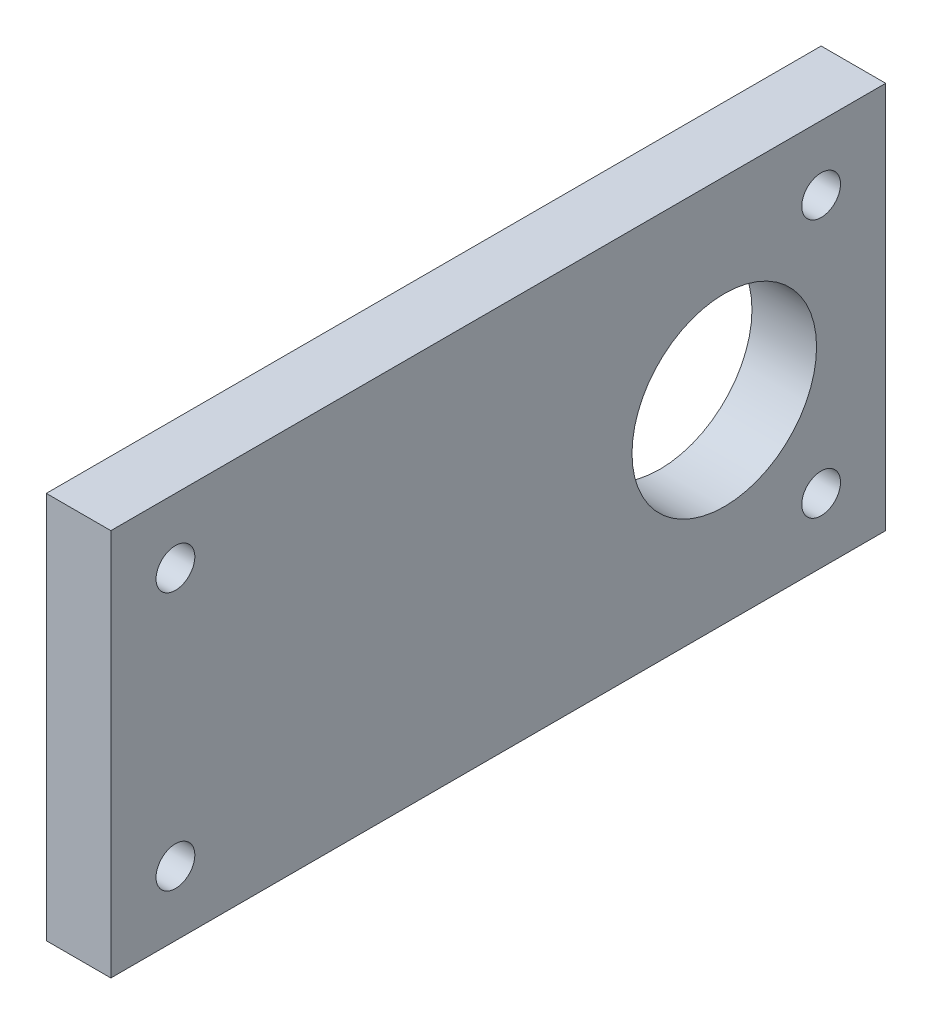
ISO-10303-21;
HEADER;
FILE_DESCRIPTION(('STEP AP214'),'2;1');
FILE_NAME('part.step','',(''),(''),'','','');
FILE_SCHEMA(('AUTOMOTIVE_DESIGN { 1 0 10303 214 1 1 1 1 }'));
ENDSEC;
DATA;
#1=APPLICATION_CONTEXT('core data for automotive mechanical design processes');
#2=APPLICATION_PROTOCOL_DEFINITION('international standard','automotive_design',2000,#1);
#3=PRODUCT_CONTEXT('',#1,'mechanical');
#4=PRODUCT('Part','Part','',(#3));
#5=PRODUCT_RELATED_PRODUCT_CATEGORY('part','',(#4));
#6=PRODUCT_DEFINITION_FORMATION('','',#4);
#7=PRODUCT_DEFINITION_CONTEXT('part definition',#1,'design');
#8=PRODUCT_DEFINITION('design','',#6,#7);
#9=PRODUCT_DEFINITION_SHAPE('','',#8);
#10=(LENGTH_UNIT() NAMED_UNIT(*) SI_UNIT(.MILLI.,.METRE.));
#11=(NAMED_UNIT(*) PLANE_ANGLE_UNIT() SI_UNIT($,.RADIAN.));
#12=(NAMED_UNIT(*) SI_UNIT($,.STERADIAN.) SOLID_ANGLE_UNIT());
#13=UNCERTAINTY_MEASURE_WITH_UNIT(LENGTH_MEASURE(1.E-05),#10,'distance_accuracy_value','');
#14=(GEOMETRIC_REPRESENTATION_CONTEXT(3) GLOBAL_UNCERTAINTY_ASSIGNED_CONTEXT((#13)) GLOBAL_UNIT_ASSIGNED_CONTEXT((#10,
#11,#12)) REPRESENTATION_CONTEXT('',''));
#15=CARTESIAN_POINT('',(0.,0.,0.));
#16=DIRECTION('',(0.,0.,1.));
#17=DIRECTION('',(1.,0.,0.));
#18=AXIS2_PLACEMENT_3D('',#15,#16,#17);
#19=CARTESIAN_POINT('',(10.,30.,80.));
#20=DIRECTION('',(0.,-1.,0.));
#21=DIRECTION('',(0.,0.,-1.));
#22=AXIS2_PLACEMENT_3D('',#19,#20,#21);
#23=PLANE('',#22);
#24=DIRECTION('',(0.,0.,1.));
#25=VECTOR('',#24,1.);
#26=CARTESIAN_POINT('',(10.,30.,80.));
#27=LINE('',#26,#25);
#28=CARTESIAN_POINT('',(10.,30.,-40.));
#29=VERTEX_POINT('',#28);
#30=CARTESIAN_POINT('',(10.,30.,80.));
#31=VERTEX_POINT('',#30);
#32=EDGE_CURVE('E95',#29,#31,#27,.T.);
#33=ORIENTED_EDGE('',*,*,#32,.F.);
#34=DIRECTION('',(-1.,0.,0.));
#35=VECTOR('',#34,1.);
#36=CARTESIAN_POINT('',(10.,30.,-40.));
#37=LINE('',#36,#35);
#38=CARTESIAN_POINT('',(0.,30.,-40.));
#39=VERTEX_POINT('',#38);
#40=EDGE_CURVE('E111',#29,#39,#37,.T.);
#41=ORIENTED_EDGE('',*,*,#40,.T.);
#42=DIRECTION('',(0.,0.,1.));
#43=VECTOR('',#42,1.);
#44=CARTESIAN_POINT('',(0.,30.,80.));
#45=LINE('',#44,#43);
#46=CARTESIAN_POINT('',(0.,30.,80.));
#47=VERTEX_POINT('',#46);
#48=EDGE_CURVE('E84',#39,#47,#45,.T.);
#49=ORIENTED_EDGE('',*,*,#48,.T.);
#50=DIRECTION('',(-1.,0.,0.));
#51=VECTOR('',#50,1.);
#52=CARTESIAN_POINT('',(10.,30.,80.));
#53=LINE('',#52,#51);
#54=EDGE_CURVE('E11',#31,#47,#53,.T.);
#55=ORIENTED_EDGE('',*,*,#54,.F.);
#56=EDGE_LOOP('',(#33,#41,#49,#55));
#57=FACE_BOUND('',#56,.T.);
#58=ADVANCED_FACE('F38',(#57),#23,.F.);
#59=CARTESIAN_POINT('',(10.,-30.,80.));
#60=DIRECTION('',(0.,0.,-1.));
#61=DIRECTION('',(-1.,0.,0.));
#62=AXIS2_PLACEMENT_3D('',#59,#60,#61);
#63=PLANE('',#62);
#64=DIRECTION('',(0.,-1.,0.));
#65=VECTOR('',#64,1.);
#66=CARTESIAN_POINT('',(0.,-30.,80.));
#67=LINE('',#66,#65);
#68=CARTESIAN_POINT('',(0.,-30.,80.));
#69=VERTEX_POINT('',#68);
#70=EDGE_CURVE('E74',#47,#69,#67,.T.);
#71=ORIENTED_EDGE('',*,*,#70,.T.);
#72=DIRECTION('',(-1.,0.,0.));
#73=VECTOR('',#72,1.);
#74=CARTESIAN_POINT('',(10.,-30.,80.));
#75=LINE('',#74,#73);
#76=CARTESIAN_POINT('',(10.,-30.,80.));
#77=VERTEX_POINT('',#76);
#78=EDGE_CURVE('E46',#77,#69,#75,.T.);
#79=ORIENTED_EDGE('',*,*,#78,.F.);
#80=DIRECTION('',(0.,-1.,0.));
#81=VECTOR('',#80,1.);
#82=CARTESIAN_POINT('',(10.,-30.,80.));
#83=LINE('',#82,#81);
#84=EDGE_CURVE('E62',#31,#77,#83,.T.);
#85=ORIENTED_EDGE('',*,*,#84,.F.);
#86=ORIENTED_EDGE('',*,*,#54,.T.);
#87=EDGE_LOOP('',(#71,#79,#85,#86));
#88=FACE_BOUND('',#87,.T.);
#89=ADVANCED_FACE('F76',(#88),#63,.F.);
#90=CARTESIAN_POINT('',(10.,-30.,80.));
#91=DIRECTION('',(0.,1.,0.));
#92=DIRECTION('',(0.,0.,1.));
#93=AXIS2_PLACEMENT_3D('',#90,#91,#92);
#94=PLANE('',#93);
#95=DIRECTION('',(0.,0.,-1.));
#96=VECTOR('',#95,1.);
#97=CARTESIAN_POINT('',(0.,-30.,80.));
#98=LINE('',#97,#96);
#99=CARTESIAN_POINT('',(0.,-30.,-40.));
#100=VERTEX_POINT('',#99);
#101=EDGE_CURVE('E83',#69,#100,#98,.T.);
#102=ORIENTED_EDGE('',*,*,#101,.T.);
#103=DIRECTION('',(-1.,0.,0.));
#104=VECTOR('',#103,1.);
#105=CARTESIAN_POINT('',(10.,-30.,-40.));
#106=LINE('',#105,#104);
#107=CARTESIAN_POINT('',(10.,-30.,-40.));
#108=VERTEX_POINT('',#107);
#109=EDGE_CURVE('E53',#108,#100,#106,.T.);
#110=ORIENTED_EDGE('',*,*,#109,.F.);
#111=DIRECTION('',(0.,0.,-1.));
#112=VECTOR('',#111,1.);
#113=CARTESIAN_POINT('',(10.,-30.,80.));
#114=LINE('',#113,#112);
#115=EDGE_CURVE('E89',#77,#108,#114,.T.);
#116=ORIENTED_EDGE('',*,*,#115,.F.);
#117=ORIENTED_EDGE('',*,*,#78,.T.);
#118=EDGE_LOOP('',(#102,#110,#116,#117));
#119=FACE_BOUND('',#118,.T.);
#120=ADVANCED_FACE('F88',(#119),#94,.F.);
#121=CARTESIAN_POINT('',(10.,0.,0.));
#122=DIRECTION('',(-1.,0.,0.));
#123=DIRECTION('',(0.,0.,1.));
#124=AXIS2_PLACEMENT_3D('',#121,#122,#123);
#125=PLANE('',#124);
#126=CARTESIAN_POINT('',(10.,-20.,70.));
#127=DIRECTION('',(-1.,0.,0.));
#128=DIRECTION('',(0.,0.,1.));
#129=AXIS2_PLACEMENT_3D('',#126,#127,#128);
#130=CIRCLE('',#129,3.00000000000001);
#131=CARTESIAN_POINT('',(10.,-20.,73.));
#132=VERTEX_POINT('',#131);
#133=EDGE_CURVE('E139',#132,#132,#130,.T.);
#134=ORIENTED_EDGE('',*,*,#133,.T.);
#135=EDGE_LOOP('',(#134));
#136=FACE_BOUND('',#135,.T.);
#137=CARTESIAN_POINT('',(10.,-20.,-30.));
#138=DIRECTION('',(-1.,0.,0.));
#139=DIRECTION('',(0.,0.,1.));
#140=AXIS2_PLACEMENT_3D('',#137,#138,#139);
#141=CIRCLE('',#140,3.);
#142=CARTESIAN_POINT('',(10.,-20.,-27.));
#143=VERTEX_POINT('',#142);
#144=EDGE_CURVE('E147',#143,#143,#141,.T.);
#145=ORIENTED_EDGE('',*,*,#144,.T.);
#146=EDGE_LOOP('',(#145));
#147=FACE_BOUND('',#146,.T.);
#148=CARTESIAN_POINT('',(10.,20.,-30.));
#149=DIRECTION('',(-1.,0.,0.));
#150=DIRECTION('',(0.,0.,1.));
#151=AXIS2_PLACEMENT_3D('',#148,#149,#150);
#152=CIRCLE('',#151,3.);
#153=CARTESIAN_POINT('',(10.,20.,-27.));
#154=VERTEX_POINT('',#153);
#155=EDGE_CURVE('E131',#154,#154,#152,.T.);
#156=ORIENTED_EDGE('',*,*,#155,.T.);
#157=EDGE_LOOP('',(#156));
#158=FACE_BOUND('',#157,.T.);
#159=CARTESIAN_POINT('',(10.,20.,70.));
#160=DIRECTION('',(-1.,0.,0.));
#161=DIRECTION('',(0.,0.,1.));
#162=AXIS2_PLACEMENT_3D('',#159,#160,#161);
#163=CIRCLE('',#162,3.00000000000001);
#164=CARTESIAN_POINT('',(10.,20.,73.));
#165=VERTEX_POINT('',#164);
#166=EDGE_CURVE('E123',#165,#165,#163,.T.);
#167=ORIENTED_EDGE('',*,*,#166,.T.);
#168=EDGE_LOOP('',(#167));
#169=FACE_BOUND('',#168,.T.);
#170=CARTESIAN_POINT('',(10.,-4.8919202022546E-13,-14.9999999999983));
#171=DIRECTION('',(-1.,0.,0.));
#172=DIRECTION('',(0.,0.,1.));
#173=AXIS2_PLACEMENT_3D('',#170,#171,#172);
#174=CIRCLE('',#173,14.289999999987);
#175=CARTESIAN_POINT('',(10.,-4.8919202022546E-13,-0.710000000011321));
#176=VERTEX_POINT('',#175);
#177=EDGE_CURVE('E102',#176,#176,#174,.T.);
#178=ORIENTED_EDGE('',*,*,#177,.T.);
#179=EDGE_LOOP('',(#178));
#180=FACE_BOUND('',#179,.T.);
#181=ORIENTED_EDGE('',*,*,#115,.T.);
#182=DIRECTION('',(0.,1.,0.));
#183=VECTOR('',#182,1.);
#184=CARTESIAN_POINT('',(10.,30.,-40.));
#185=LINE('',#184,#183);
#186=EDGE_CURVE('E117',#108,#29,#185,.T.);
#187=ORIENTED_EDGE('',*,*,#186,.T.);
#188=ORIENTED_EDGE('',*,*,#32,.T.);
#189=ORIENTED_EDGE('',*,*,#84,.T.);
#190=EDGE_LOOP('',(#181,#187,#188,#189));
#191=FACE_BOUND('',#190,.T.);
#192=ADVANCED_FACE('F159',(#136,#147,#158,#169,#180,#191),#125,.F.);
#193=CARTESIAN_POINT('',(0.,0.,0.));
#194=DIRECTION('',(-1.,0.,0.));
#195=DIRECTION('',(0.,0.,1.));
#196=AXIS2_PLACEMENT_3D('',#193,#194,#195);
#197=PLANE('',#196);
#198=CARTESIAN_POINT('',(0.,-20.,70.));
#199=DIRECTION('',(-1.,0.,0.));
#200=DIRECTION('',(0.,0.,1.));
#201=AXIS2_PLACEMENT_3D('',#198,#199,#200);
#202=CIRCLE('',#201,3.00000000000001);
#203=CARTESIAN_POINT('',(0.,-20.,73.));
#204=VERTEX_POINT('',#203);
#205=EDGE_CURVE('E135',#204,#204,#202,.T.);
#206=ORIENTED_EDGE('',*,*,#205,.F.);
#207=EDGE_LOOP('',(#206));
#208=FACE_BOUND('',#207,.T.);
#209=CARTESIAN_POINT('',(0.,-20.,-30.));
#210=DIRECTION('',(-1.,0.,0.));
#211=DIRECTION('',(0.,0.,1.));
#212=AXIS2_PLACEMENT_3D('',#209,#210,#211);
#213=CIRCLE('',#212,3.);
#214=CARTESIAN_POINT('',(0.,-20.,-27.));
#215=VERTEX_POINT('',#214);
#216=EDGE_CURVE('E143',#215,#215,#213,.T.);
#217=ORIENTED_EDGE('',*,*,#216,.F.);
#218=EDGE_LOOP('',(#217));
#219=FACE_BOUND('',#218,.T.);
#220=CARTESIAN_POINT('',(0.,20.,-30.));
#221=DIRECTION('',(-1.,0.,0.));
#222=DIRECTION('',(0.,0.,1.));
#223=AXIS2_PLACEMENT_3D('',#220,#221,#222);
#224=CIRCLE('',#223,3.);
#225=CARTESIAN_POINT('',(0.,20.,-27.));
#226=VERTEX_POINT('',#225);
#227=EDGE_CURVE('E151',#226,#226,#224,.T.);
#228=ORIENTED_EDGE('',*,*,#227,.F.);
#229=EDGE_LOOP('',(#228));
#230=FACE_BOUND('',#229,.T.);
#231=CARTESIAN_POINT('',(0.,20.,70.));
#232=DIRECTION('',(-1.,0.,0.));
#233=DIRECTION('',(0.,0.,1.));
#234=AXIS2_PLACEMENT_3D('',#231,#232,#233);
#235=CIRCLE('',#234,3.00000000000001);
#236=CARTESIAN_POINT('',(0.,20.,73.));
#237=VERTEX_POINT('',#236);
#238=EDGE_CURVE('E127',#237,#237,#235,.T.);
#239=ORIENTED_EDGE('',*,*,#238,.F.);
#240=EDGE_LOOP('',(#239));
#241=FACE_BOUND('',#240,.T.);
#242=DIRECTION('',(0.,1.,0.));
#243=VECTOR('',#242,1.);
#244=CARTESIAN_POINT('',(0.,30.,-40.));
#245=LINE('',#244,#243);
#246=EDGE_CURVE('E93',#100,#39,#245,.T.);
#247=ORIENTED_EDGE('',*,*,#246,.F.);
#248=ORIENTED_EDGE('',*,*,#101,.F.);
#249=ORIENTED_EDGE('',*,*,#70,.F.);
#250=ORIENTED_EDGE('',*,*,#48,.F.);
#251=EDGE_LOOP('',(#247,#248,#249,#250));
#252=FACE_BOUND('',#251,.T.);
#253=CARTESIAN_POINT('',(0.,-4.8919202022546E-13,-14.9999999999983));
#254=DIRECTION('',(-1.,0.,0.));
#255=DIRECTION('',(0.,0.,1.));
#256=AXIS2_PLACEMENT_3D('',#253,#254,#255);
#257=CIRCLE('',#256,14.289999999987);
#258=CARTESIAN_POINT('',(0.,-4.8919202022546E-13,-0.710000000011321));
#259=VERTEX_POINT('',#258);
#260=EDGE_CURVE('E107',#259,#259,#257,.T.);
#261=ORIENTED_EDGE('',*,*,#260,.F.);
#262=EDGE_LOOP('',(#261));
#263=FACE_BOUND('',#262,.T.);
#264=ADVANCED_FACE('F91',(#208,#219,#230,#241,#252,#263),#197,.T.);
#265=CARTESIAN_POINT('',(10.,-4.8919202022546E-13,-14.9999999999983));
#266=DIRECTION('',(-1.,0.,0.));
#267=DIRECTION('',(0.,0.,1.));
#268=AXIS2_PLACEMENT_3D('',#265,#266,#267);
#269=CYLINDRICAL_SURFACE('',#268,14.289999999987);
#270=ORIENTED_EDGE('',*,*,#177,.F.);
#271=EDGE_LOOP('',(#270));
#272=FACE_BOUND('',#271,.T.);
#273=ORIENTED_EDGE('',*,*,#260,.T.);
#274=EDGE_LOOP('',(#273));
#275=FACE_BOUND('',#274,.T.);
#276=ADVANCED_FACE('F172',(#272,#275),#269,.F.);
#277=CARTESIAN_POINT('',(10.,30.,-40.));
#278=DIRECTION('',(0.,0.,1.));
#279=DIRECTION('',(0.,-1.,0.));
#280=AXIS2_PLACEMENT_3D('',#277,#278,#279);
#281=PLANE('',#280);
#282=ORIENTED_EDGE('',*,*,#246,.T.);
#283=ORIENTED_EDGE('',*,*,#40,.F.);
#284=ORIENTED_EDGE('',*,*,#186,.F.);
#285=ORIENTED_EDGE('',*,*,#109,.T.);
#286=EDGE_LOOP('',(#282,#283,#284,#285));
#287=FACE_BOUND('',#286,.T.);
#288=ADVANCED_FACE('F178',(#287),#281,.F.);
#289=CARTESIAN_POINT('',(10.,20.,70.));
#290=DIRECTION('',(-1.,0.,0.));
#291=DIRECTION('',(0.,0.,1.));
#292=AXIS2_PLACEMENT_3D('',#289,#290,#291);
#293=CYLINDRICAL_SURFACE('',#292,3.00000000000001);
#294=ORIENTED_EDGE('',*,*,#166,.F.);
#295=EDGE_LOOP('',(#294));
#296=FACE_BOUND('',#295,.T.);
#297=ORIENTED_EDGE('',*,*,#238,.T.);
#298=EDGE_LOOP('',(#297));
#299=FACE_BOUND('',#298,.T.);
#300=ADVANCED_FACE('F166',(#296,#299),#293,.F.);
#301=CARTESIAN_POINT('',(10.,20.,-30.));
#302=DIRECTION('',(-1.,0.,0.));
#303=DIRECTION('',(0.,0.,1.));
#304=AXIS2_PLACEMENT_3D('',#301,#302,#303);
#305=CYLINDRICAL_SURFACE('',#304,3.);
#306=ORIENTED_EDGE('',*,*,#155,.F.);
#307=EDGE_LOOP('',(#306));
#308=FACE_BOUND('',#307,.T.);
#309=ORIENTED_EDGE('',*,*,#227,.T.);
#310=EDGE_LOOP('',(#309));
#311=FACE_BOUND('',#310,.T.);
#312=ADVANCED_FACE('F162',(#308,#311),#305,.F.);
#313=CARTESIAN_POINT('',(10.,-20.,-30.));
#314=DIRECTION('',(-1.,0.,0.));
#315=DIRECTION('',(0.,0.,1.));
#316=AXIS2_PLACEMENT_3D('',#313,#314,#315);
#317=CYLINDRICAL_SURFACE('',#316,3.);
#318=ORIENTED_EDGE('',*,*,#144,.F.);
#319=EDGE_LOOP('',(#318));
#320=FACE_BOUND('',#319,.T.);
#321=ORIENTED_EDGE('',*,*,#216,.T.);
#322=EDGE_LOOP('',(#321));
#323=FACE_BOUND('',#322,.T.);
#324=ADVANCED_FACE('F165',(#320,#323),#317,.F.);
#325=CARTESIAN_POINT('',(10.,-20.,70.));
#326=DIRECTION('',(-1.,0.,0.));
#327=DIRECTION('',(0.,0.,1.));
#328=AXIS2_PLACEMENT_3D('',#325,#326,#327);
#329=CYLINDRICAL_SURFACE('',#328,3.00000000000001);
#330=ORIENTED_EDGE('',*,*,#133,.F.);
#331=EDGE_LOOP('',(#330));
#332=FACE_BOUND('',#331,.T.);
#333=ORIENTED_EDGE('',*,*,#205,.T.);
#334=EDGE_LOOP('',(#333));
#335=FACE_BOUND('',#334,.T.);
#336=ADVANCED_FACE('F265',(#332,#335),#329,.F.);
#337=CLOSED_SHELL('',(#58,#89,#120,#192,#264,#276,#288,#300,#312,#324,#336));
#338=MANIFOLD_SOLID_BREP('B2',#337);
#339=ADVANCED_BREP_SHAPE_REPRESENTATION('',(#18,#338),#14);
#340=SHAPE_DEFINITION_REPRESENTATION(#9,#339);
ENDSEC;
END-ISO-10303-21;
